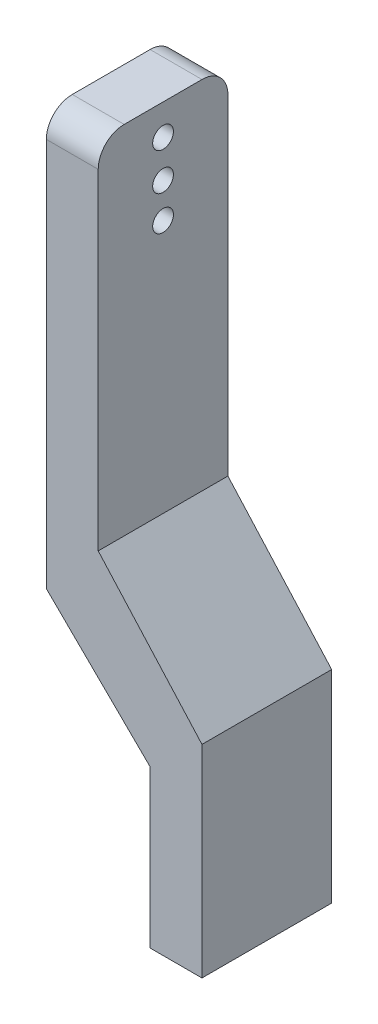
ISO-10303-21;
HEADER;
FILE_DESCRIPTION(('STEP AP214'),'2;1');
FILE_NAME('part.step','',(''),(''),'','','');
FILE_SCHEMA(('AUTOMOTIVE_DESIGN { 1 0 10303 214 1 1 1 1 }'));
ENDSEC;
DATA;
#1=APPLICATION_CONTEXT('core data for automotive mechanical design processes');
#2=APPLICATION_PROTOCOL_DEFINITION('international standard','automotive_design',2000,#1);
#3=PRODUCT_CONTEXT('',#1,'mechanical');
#4=PRODUCT('Part','Part','',(#3));
#5=PRODUCT_RELATED_PRODUCT_CATEGORY('part','',(#4));
#6=PRODUCT_DEFINITION_FORMATION('','',#4);
#7=PRODUCT_DEFINITION_CONTEXT('part definition',#1,'design');
#8=PRODUCT_DEFINITION('design','',#6,#7);
#9=PRODUCT_DEFINITION_SHAPE('','',#8);
#10=(LENGTH_UNIT() NAMED_UNIT(*) SI_UNIT(.MILLI.,.METRE.));
#11=(NAMED_UNIT(*) PLANE_ANGLE_UNIT() SI_UNIT($,.RADIAN.));
#12=(NAMED_UNIT(*) SI_UNIT($,.STERADIAN.) SOLID_ANGLE_UNIT());
#13=UNCERTAINTY_MEASURE_WITH_UNIT(LENGTH_MEASURE(1.E-05),#10,'distance_accuracy_value','');
#14=(GEOMETRIC_REPRESENTATION_CONTEXT(3) GLOBAL_UNCERTAINTY_ASSIGNED_CONTEXT((#13)) GLOBAL_UNIT_ASSIGNED_CONTEXT((#10,
#11,#12)) REPRESENTATION_CONTEXT('',''));
#15=CARTESIAN_POINT('',(0.,0.,0.));
#16=DIRECTION('',(0.,0.,1.));
#17=DIRECTION('',(1.,0.,0.));
#18=AXIS2_PLACEMENT_3D('',#15,#16,#17);
#19=CARTESIAN_POINT('',(30.,0.,25.));
#20=DIRECTION('',(1.,0.,0.));
#21=DIRECTION('',(0.,1.,0.));
#22=AXIS2_PLACEMENT_3D('',#19,#20,#21);
#23=PLANE('',#22);
#24=DIRECTION('',(0.,-1.,0.));
#25=VECTOR('',#24,1.);
#26=CARTESIAN_POINT('',(30.,0.,0.));
#27=LINE('',#26,#25);
#28=CARTESIAN_POINT('',(30.,-11.0027993061037,0.));
#29=VERTEX_POINT('',#28);
#30=CARTESIAN_POINT('',(30.,-50.,0.));
#31=VERTEX_POINT('',#30);
#32=EDGE_CURVE('E124',#29,#31,#27,.T.);
#33=ORIENTED_EDGE('',*,*,#32,.F.);
#34=DIRECTION('',(0.,0.,-1.));
#35=VECTOR('',#34,1.);
#36=CARTESIAN_POINT('',(30.,-11.0027993061037,25.));
#37=LINE('',#36,#35);
#38=CARTESIAN_POINT('',(30.,-11.0027993061037,25.));
#39=VERTEX_POINT('',#38);
#40=EDGE_CURVE('E119',#39,#29,#37,.T.);
#41=ORIENTED_EDGE('',*,*,#40,.F.);
#42=DIRECTION('',(0.,-1.,0.));
#43=VECTOR('',#42,1.);
#44=CARTESIAN_POINT('',(30.,0.,25.));
#45=LINE('',#44,#43);
#46=CARTESIAN_POINT('',(30.,-50.,25.));
#47=VERTEX_POINT('',#46);
#48=EDGE_CURVE('E121',#39,#47,#45,.T.);
#49=ORIENTED_EDGE('',*,*,#48,.T.);
#50=DIRECTION('',(0.,0.,-1.));
#51=VECTOR('',#50,1.);
#52=CARTESIAN_POINT('',(30.,-50.,25.));
#53=LINE('',#52,#51);
#54=EDGE_CURVE('E168',#47,#31,#53,.T.);
#55=ORIENTED_EDGE('',*,*,#54,.T.);
#56=EDGE_LOOP('',(#33,#41,#49,#55));
#57=FACE_BOUND('',#56,.T.);
#58=ADVANCED_FACE('F41',(#57),#23,.T.);
#59=CARTESIAN_POINT('',(11.1575041199395,10.006682870404,25.));
#60=DIRECTION('',(0.744456564774586,0.667670894351419,0.));
#61=DIRECTION('',(-0.667670894351419,0.744456564774586,0.));
#62=AXIS2_PLACEMENT_3D('',#59,#60,#61);
#63=PLANE('',#62);
#64=DIRECTION('',(0.667670894351419,-0.744456564774586,0.));
#65=VECTOR('',#64,1.);
#66=CARTESIAN_POINT('',(11.1575041199395,10.006682870404,0.));
#67=LINE('',#66,#65);
#68=CARTESIAN_POINT('',(10.,11.297306062358,0.));
#69=VERTEX_POINT('',#68);
#70=EDGE_CURVE('E171',#69,#29,#67,.T.);
#71=ORIENTED_EDGE('',*,*,#70,.F.);
#72=DIRECTION('',(0.,0.,-1.));
#73=VECTOR('',#72,1.);
#74=CARTESIAN_POINT('',(10.,11.297306062358,25.));
#75=LINE('',#74,#73);
#76=CARTESIAN_POINT('',(10.,11.297306062358,25.));
#77=VERTEX_POINT('',#76);
#78=EDGE_CURVE('E131',#77,#69,#75,.T.);
#79=ORIENTED_EDGE('',*,*,#78,.F.);
#80=DIRECTION('',(0.667670894351419,-0.744456564774586,0.));
#81=VECTOR('',#80,1.);
#82=CARTESIAN_POINT('',(11.1575041199395,10.006682870404,25.));
#83=LINE('',#82,#81);
#84=EDGE_CURVE('E137',#77,#39,#83,.T.);
#85=ORIENTED_EDGE('',*,*,#84,.T.);
#86=ORIENTED_EDGE('',*,*,#40,.T.);
#87=EDGE_LOOP('',(#71,#79,#85,#86));
#88=FACE_BOUND('',#87,.T.);
#89=ADVANCED_FACE('F145',(#88),#63,.T.);
#90=CARTESIAN_POINT('',(10.,0.,25.));
#91=DIRECTION('',(1.,0.,0.));
#92=DIRECTION('',(0.,1.,0.));
#93=AXIS2_PLACEMENT_3D('',#90,#91,#92);
#94=PLANE('',#93);
#95=CARTESIAN_POINT('',(10.,74.088859677376,12.5));
#96=DIRECTION('',(1.,0.,0.));
#97=DIRECTION('',(0.,1.,0.));
#98=AXIS2_PLACEMENT_3D('',#95,#96,#97);
#99=CIRCLE('',#98,2.);
#100=CARTESIAN_POINT('',(10.,76.088859677376,12.5));
#101=VERTEX_POINT('',#100);
#102=EDGE_CURVE('E172',#101,#101,#99,.T.);
#103=ORIENTED_EDGE('',*,*,#102,.F.);
#104=EDGE_LOOP('',(#103));
#105=FACE_BOUND('',#104,.T.);
#106=CARTESIAN_POINT('',(10.,66.9038959237328,12.5));
#107=DIRECTION('',(1.,0.,0.));
#108=DIRECTION('',(0.,1.,0.));
#109=AXIS2_PLACEMENT_3D('',#106,#107,#108);
#110=CIRCLE('',#109,2.);
#111=CARTESIAN_POINT('',(10.,68.9038959237328,12.5));
#112=VERTEX_POINT('',#111);
#113=EDGE_CURVE('E308',#112,#112,#110,.T.);
#114=ORIENTED_EDGE('',*,*,#113,.F.);
#115=EDGE_LOOP('',(#114));
#116=FACE_BOUND('',#115,.T.);
#117=CARTESIAN_POINT('',(10.,60.207705214555,12.5));
#118=DIRECTION('',(1.,0.,0.));
#119=DIRECTION('',(0.,1.,0.));
#120=AXIS2_PLACEMENT_3D('',#117,#118,#119);
#121=CIRCLE('',#120,2.);
#122=CARTESIAN_POINT('',(10.,62.207705214555,12.5));
#123=VERTEX_POINT('',#122);
#124=EDGE_CURVE('E302',#123,#123,#121,.T.);
#125=ORIENTED_EDGE('',*,*,#124,.F.);
#126=EDGE_LOOP('',(#125));
#127=FACE_BOUND('',#126,.T.);
#128=DIRECTION('',(0.,-1.,0.));
#129=VECTOR('',#128,1.);
#130=CARTESIAN_POINT('',(10.,0.,0.));
#131=LINE('',#130,#129);
#132=CARTESIAN_POINT('',(10.,75.,0.));
#133=VERTEX_POINT('',#132);
#134=EDGE_CURVE('E175',#133,#69,#131,.T.);
#135=ORIENTED_EDGE('',*,*,#134,.F.);
#136=CARTESIAN_POINT('',(10.,75.,5.));
#137=DIRECTION('',(1.,0.,0.));
#138=DIRECTION('',(0.,1.,0.));
#139=AXIS2_PLACEMENT_3D('',#136,#137,#138);
#140=CIRCLE('',#139,5.);
#141=CARTESIAN_POINT('',(10.,80.,5.));
#142=VERTEX_POINT('',#141);
#143=EDGE_CURVE('E64',#133,#142,#140,.T.);
#144=ORIENTED_EDGE('',*,*,#143,.T.);
#145=DIRECTION('',(0.,0.,-1.));
#146=VECTOR('',#145,1.);
#147=CARTESIAN_POINT('',(10.,80.,25.));
#148=LINE('',#147,#146);
#149=CARTESIAN_POINT('',(10.,80.,20.));
#150=VERTEX_POINT('',#149);
#151=EDGE_CURVE('E207',#150,#142,#148,.T.);
#152=ORIENTED_EDGE('',*,*,#151,.F.);
#153=CARTESIAN_POINT('',(10.,75.,20.));
#154=DIRECTION('',(1.,0.,0.));
#155=DIRECTION('',(0.,1.,0.));
#156=AXIS2_PLACEMENT_3D('',#153,#154,#155);
#157=CIRCLE('',#156,5.);
#158=CARTESIAN_POINT('',(10.,75.,25.));
#159=VERTEX_POINT('',#158);
#160=EDGE_CURVE('E215',#150,#159,#157,.T.);
#161=ORIENTED_EDGE('',*,*,#160,.T.);
#162=DIRECTION('',(0.,-1.,0.));
#163=VECTOR('',#162,1.);
#164=CARTESIAN_POINT('',(10.,0.,25.));
#165=LINE('',#164,#163);
#166=EDGE_CURVE('E148',#159,#77,#165,.T.);
#167=ORIENTED_EDGE('',*,*,#166,.T.);
#168=ORIENTED_EDGE('',*,*,#78,.T.);
#169=EDGE_LOOP('',(#135,#144,#152,#161,#167,#168));
#170=FACE_BOUND('',#169,.T.);
#171=ADVANCED_FACE('F236',(#105,#116,#127,#170),#94,.T.);
#172=CARTESIAN_POINT('',(0.,80.,25.));
#173=DIRECTION('',(0.,1.,0.));
#174=DIRECTION('',(0.,0.,1.));
#175=AXIS2_PLACEMENT_3D('',#172,#173,#174);
#176=PLANE('',#175);
#177=ORIENTED_EDGE('',*,*,#151,.T.);
#178=DIRECTION('',(1.,0.,0.));
#179=VECTOR('',#178,1.);
#180=CARTESIAN_POINT('',(0.,80.,5.));
#181=LINE('',#180,#179);
#182=CARTESIAN_POINT('',(0.,80.,5.));
#183=VERTEX_POINT('',#182);
#184=EDGE_CURVE('E50',#142,#183,#181,.F.);
#185=ORIENTED_EDGE('',*,*,#184,.T.);
#186=DIRECTION('',(0.,0.,-1.));
#187=VECTOR('',#186,1.);
#188=CARTESIAN_POINT('',(0.,80.,25.));
#189=LINE('',#188,#187);
#190=CARTESIAN_POINT('',(0.,80.,20.));
#191=VERTEX_POINT('',#190);
#192=EDGE_CURVE('E204',#191,#183,#189,.T.);
#193=ORIENTED_EDGE('',*,*,#192,.F.);
#194=DIRECTION('',(1.,0.,0.));
#195=VECTOR('',#194,1.);
#196=CARTESIAN_POINT('',(0.,80.,20.));
#197=LINE('',#196,#195);
#198=EDGE_CURVE('E130',#191,#150,#197,.T.);
#199=ORIENTED_EDGE('',*,*,#198,.T.);
#200=EDGE_LOOP('',(#177,#185,#193,#199));
#201=FACE_BOUND('',#200,.T.);
#202=ADVANCED_FACE('F266',(#201),#176,.T.);
#203=CARTESIAN_POINT('',(0.,0.,25.));
#204=DIRECTION('',(-1.,0.,0.));
#205=DIRECTION('',(0.,0.,1.));
#206=AXIS2_PLACEMENT_3D('',#203,#204,#205);
#207=PLANE('',#206);
#208=CARTESIAN_POINT('',(0.,74.088859677376,12.5));
#209=DIRECTION('',(-1.,0.,0.));
#210=DIRECTION('',(0.,0.,1.));
#211=AXIS2_PLACEMENT_3D('',#208,#209,#210);
#212=CIRCLE('',#211,2.);
#213=CARTESIAN_POINT('',(0.,74.088859677376,14.5));
#214=VERTEX_POINT('',#213);
#215=EDGE_CURVE('E300',#214,#214,#212,.T.);
#216=ORIENTED_EDGE('',*,*,#215,.F.);
#217=EDGE_LOOP('',(#216));
#218=FACE_BOUND('',#217,.T.);
#219=CARTESIAN_POINT('',(0.,66.9038959237328,12.5));
#220=DIRECTION('',(-1.,0.,0.));
#221=DIRECTION('',(0.,0.,1.));
#222=AXIS2_PLACEMENT_3D('',#219,#220,#221);
#223=CIRCLE('',#222,2.);
#224=CARTESIAN_POINT('',(0.,66.9038959237328,14.5));
#225=VERTEX_POINT('',#224);
#226=EDGE_CURVE('E303',#225,#225,#223,.T.);
#227=ORIENTED_EDGE('',*,*,#226,.F.);
#228=EDGE_LOOP('',(#227));
#229=FACE_BOUND('',#228,.T.);
#230=CARTESIAN_POINT('',(0.,60.207705214555,12.5));
#231=DIRECTION('',(-1.,0.,0.));
#232=DIRECTION('',(0.,0.,1.));
#233=AXIS2_PLACEMENT_3D('',#230,#231,#232);
#234=CIRCLE('',#233,2.);
#235=CARTESIAN_POINT('',(0.,60.207705214555,14.5));
#236=VERTEX_POINT('',#235);
#237=EDGE_CURVE('E311',#236,#236,#234,.T.);
#238=ORIENTED_EDGE('',*,*,#237,.F.);
#239=EDGE_LOOP('',(#238));
#240=FACE_BOUND('',#239,.T.);
#241=ORIENTED_EDGE('',*,*,#192,.T.);
#242=CARTESIAN_POINT('',(0.,75.,5.));
#243=DIRECTION('',(-1.,0.,0.));
#244=DIRECTION('',(0.,0.,1.));
#245=AXIS2_PLACEMENT_3D('',#242,#243,#244);
#246=CIRCLE('',#245,5.);
#247=CARTESIAN_POINT('',(0.,75.,0.));
#248=VERTEX_POINT('',#247);
#249=EDGE_CURVE('E11',#183,#248,#246,.T.);
#250=ORIENTED_EDGE('',*,*,#249,.T.);
#251=DIRECTION('',(0.,1.,0.));
#252=VECTOR('',#251,1.);
#253=CARTESIAN_POINT('',(0.,0.,0.));
#254=LINE('',#253,#252);
#255=CARTESIAN_POINT('',(0.,0.,0.));
#256=VERTEX_POINT('',#255);
#257=EDGE_CURVE('E178',#256,#248,#254,.T.);
#258=ORIENTED_EDGE('',*,*,#257,.F.);
#259=DIRECTION('',(0.,0.,-1.));
#260=VECTOR('',#259,1.);
#261=CARTESIAN_POINT('',(0.,0.,25.));
#262=LINE('',#261,#260);
#263=CARTESIAN_POINT('',(0.,0.,25.));
#264=VERTEX_POINT('',#263);
#265=EDGE_CURVE('E201',#264,#256,#262,.T.);
#266=ORIENTED_EDGE('',*,*,#265,.F.);
#267=DIRECTION('',(0.,1.,0.));
#268=VECTOR('',#267,1.);
#269=CARTESIAN_POINT('',(0.,0.,25.));
#270=LINE('',#269,#268);
#271=CARTESIAN_POINT('',(0.,75.,25.));
#272=VERTEX_POINT('',#271);
#273=EDGE_CURVE('E151',#264,#272,#270,.T.);
#274=ORIENTED_EDGE('',*,*,#273,.T.);
#275=CARTESIAN_POINT('',(0.,75.,20.));
#276=DIRECTION('',(-1.,0.,0.));
#277=DIRECTION('',(0.,0.,1.));
#278=AXIS2_PLACEMENT_3D('',#275,#276,#277);
#279=CIRCLE('',#278,5.);
#280=EDGE_CURVE('E221',#272,#191,#279,.T.);
#281=ORIENTED_EDGE('',*,*,#280,.T.);
#282=EDGE_LOOP('',(#241,#250,#258,#266,#274,#281));
#283=FACE_BOUND('',#282,.T.);
#284=ADVANCED_FACE('F249',(#218,#229,#240,#283),#207,.T.);
#285=CARTESIAN_POINT('',(0.,0.,25.));
#286=DIRECTION('',(-0.702396335883424,-0.711786054469698,0.));
#287=DIRECTION('',(0.711786054469698,-0.702396335883424,0.));
#288=AXIS2_PLACEMENT_3D('',#285,#286,#287);
#289=PLANE('',#288);
#290=DIRECTION('',(-0.711786054469698,0.702396335883424,0.));
#291=VECTOR('',#290,1.);
#292=CARTESIAN_POINT('',(0.,0.,0.));
#293=LINE('',#292,#291);
#294=CARTESIAN_POINT('',(20.,-19.7361645812724,0.));
#295=VERTEX_POINT('',#294);
#296=EDGE_CURVE('E182',#295,#256,#293,.T.);
#297=ORIENTED_EDGE('',*,*,#296,.F.);
#298=DIRECTION('',(0.,0.,-1.));
#299=VECTOR('',#298,1.);
#300=CARTESIAN_POINT('',(20.,-19.7361645812724,25.));
#301=LINE('',#300,#299);
#302=CARTESIAN_POINT('',(20.,-19.7361645812724,25.));
#303=VERTEX_POINT('',#302);
#304=EDGE_CURVE('E198',#303,#295,#301,.T.);
#305=ORIENTED_EDGE('',*,*,#304,.F.);
#306=DIRECTION('',(-0.711786054469698,0.702396335883424,0.));
#307=VECTOR('',#306,1.);
#308=CARTESIAN_POINT('',(0.,0.,25.));
#309=LINE('',#308,#307);
#310=EDGE_CURVE('E158',#303,#264,#309,.T.);
#311=ORIENTED_EDGE('',*,*,#310,.T.);
#312=ORIENTED_EDGE('',*,*,#265,.T.);
#313=EDGE_LOOP('',(#297,#305,#311,#312));
#314=FACE_BOUND('',#313,.T.);
#315=ADVANCED_FACE('F245',(#314),#289,.T.);
#316=CARTESIAN_POINT('',(20.,0.,25.));
#317=DIRECTION('',(-1.,0.,0.));
#318=DIRECTION('',(0.,0.,1.));
#319=AXIS2_PLACEMENT_3D('',#316,#317,#318);
#320=PLANE('',#319);
#321=DIRECTION('',(0.,1.,0.));
#322=VECTOR('',#321,1.);
#323=CARTESIAN_POINT('',(20.,0.,0.));
#324=LINE('',#323,#322);
#325=CARTESIAN_POINT('',(20.,-50.,0.));
#326=VERTEX_POINT('',#325);
#327=EDGE_CURVE('E186',#326,#295,#324,.T.);
#328=ORIENTED_EDGE('',*,*,#327,.F.);
#329=DIRECTION('',(0.,0.,-1.));
#330=VECTOR('',#329,1.);
#331=CARTESIAN_POINT('',(20.,-50.,25.));
#332=LINE('',#331,#330);
#333=CARTESIAN_POINT('',(20.,-50.,25.));
#334=VERTEX_POINT('',#333);
#335=EDGE_CURVE('E195',#334,#326,#332,.T.);
#336=ORIENTED_EDGE('',*,*,#335,.F.);
#337=DIRECTION('',(0.,1.,0.));
#338=VECTOR('',#337,1.);
#339=CARTESIAN_POINT('',(20.,0.,25.));
#340=LINE('',#339,#338);
#341=EDGE_CURVE('E162',#334,#303,#340,.T.);
#342=ORIENTED_EDGE('',*,*,#341,.T.);
#343=ORIENTED_EDGE('',*,*,#304,.T.);
#344=EDGE_LOOP('',(#328,#336,#342,#343));
#345=FACE_BOUND('',#344,.T.);
#346=ADVANCED_FACE('F242',(#345),#320,.T.);
#347=CARTESIAN_POINT('',(0.,-50.,25.));
#348=DIRECTION('',(0.,-1.,0.));
#349=DIRECTION('',(0.,0.,-1.));
#350=AXIS2_PLACEMENT_3D('',#347,#348,#349);
#351=PLANE('',#350);
#352=DIRECTION('',(-1.,0.,0.));
#353=VECTOR('',#352,1.);
#354=CARTESIAN_POINT('',(0.,-50.,0.));
#355=LINE('',#354,#353);
#356=EDGE_CURVE('E142',#31,#326,#355,.T.);
#357=ORIENTED_EDGE('',*,*,#356,.F.);
#358=ORIENTED_EDGE('',*,*,#54,.F.);
#359=DIRECTION('',(-1.,0.,0.));
#360=VECTOR('',#359,1.);
#361=CARTESIAN_POINT('',(0.,-50.,25.));
#362=LINE('',#361,#360);
#363=EDGE_CURVE('E140',#47,#334,#362,.T.);
#364=ORIENTED_EDGE('',*,*,#363,.T.);
#365=ORIENTED_EDGE('',*,*,#335,.T.);
#366=EDGE_LOOP('',(#357,#358,#364,#365));
#367=FACE_BOUND('',#366,.T.);
#368=ADVANCED_FACE('F239',(#367),#351,.T.);
#369=CARTESIAN_POINT('',(0.,0.,25.));
#370=DIRECTION('',(0.,0.,1.));
#371=DIRECTION('',(1.,0.,0.));
#372=AXIS2_PLACEMENT_3D('',#369,#370,#371);
#373=PLANE('',#372);
#374=ORIENTED_EDGE('',*,*,#166,.F.);
#375=DIRECTION('',(1.,0.,0.));
#376=VECTOR('',#375,1.);
#377=CARTESIAN_POINT('',(0.,75.,25.));
#378=LINE('',#377,#376);
#379=EDGE_CURVE('E218',#159,#272,#378,.F.);
#380=ORIENTED_EDGE('',*,*,#379,.T.);
#381=ORIENTED_EDGE('',*,*,#273,.F.);
#382=ORIENTED_EDGE('',*,*,#310,.F.);
#383=ORIENTED_EDGE('',*,*,#341,.F.);
#384=ORIENTED_EDGE('',*,*,#363,.F.);
#385=ORIENTED_EDGE('',*,*,#48,.F.);
#386=ORIENTED_EDGE('',*,*,#84,.F.);
#387=EDGE_LOOP('',(#374,#380,#381,#382,#383,#384,#385,#386));
#388=FACE_BOUND('',#387,.T.);
#389=ADVANCED_FACE('F136',(#388),#373,.T.);
#390=CARTESIAN_POINT('',(0.,0.,0.));
#391=DIRECTION('',(0.,0.,1.));
#392=DIRECTION('',(1.,0.,0.));
#393=AXIS2_PLACEMENT_3D('',#390,#391,#392);
#394=PLANE('',#393);
#395=ORIENTED_EDGE('',*,*,#257,.T.);
#396=DIRECTION('',(1.,0.,0.));
#397=VECTOR('',#396,1.);
#398=CARTESIAN_POINT('',(10.,75.,0.));
#399=LINE('',#398,#397);
#400=EDGE_CURVE('E224',#248,#133,#399,.T.);
#401=ORIENTED_EDGE('',*,*,#400,.T.);
#402=ORIENTED_EDGE('',*,*,#134,.T.);
#403=ORIENTED_EDGE('',*,*,#70,.T.);
#404=ORIENTED_EDGE('',*,*,#32,.T.);
#405=ORIENTED_EDGE('',*,*,#356,.T.);
#406=ORIENTED_EDGE('',*,*,#327,.T.);
#407=ORIENTED_EDGE('',*,*,#296,.T.);
#408=EDGE_LOOP('',(#395,#401,#402,#403,#404,#405,#406,#407));
#409=FACE_BOUND('',#408,.T.);
#410=ADVANCED_FACE('F232',(#409),#394,.F.);
#411=CARTESIAN_POINT('',(25.,60.207705214555,12.5));
#412=DIRECTION('',(-1.,0.,0.));
#413=DIRECTION('',(0.,0.,1.));
#414=AXIS2_PLACEMENT_3D('',#411,#412,#413);
#415=CYLINDRICAL_SURFACE('',#414,2.);
#416=ORIENTED_EDGE('',*,*,#124,.T.);
#417=EDGE_LOOP('',(#416));
#418=FACE_BOUND('',#417,.T.);
#419=ORIENTED_EDGE('',*,*,#237,.T.);
#420=EDGE_LOOP('',(#419));
#421=FACE_BOUND('',#420,.T.);
#422=ADVANCED_FACE('F281',(#418,#421),#415,.F.);
#423=CARTESIAN_POINT('',(25.,66.9038959237328,12.5));
#424=DIRECTION('',(-1.,0.,0.));
#425=DIRECTION('',(0.,0.,1.));
#426=AXIS2_PLACEMENT_3D('',#423,#424,#425);
#427=CYLINDRICAL_SURFACE('',#426,2.);
#428=ORIENTED_EDGE('',*,*,#113,.T.);
#429=EDGE_LOOP('',(#428));
#430=FACE_BOUND('',#429,.T.);
#431=ORIENTED_EDGE('',*,*,#226,.T.);
#432=EDGE_LOOP('',(#431));
#433=FACE_BOUND('',#432,.T.);
#434=ADVANCED_FACE('F286',(#430,#433),#427,.F.);
#435=CARTESIAN_POINT('',(25.,74.088859677376,12.5));
#436=DIRECTION('',(-1.,0.,0.));
#437=DIRECTION('',(0.,0.,1.));
#438=AXIS2_PLACEMENT_3D('',#435,#436,#437);
#439=CYLINDRICAL_SURFACE('',#438,2.);
#440=ORIENTED_EDGE('',*,*,#102,.T.);
#441=EDGE_LOOP('',(#440));
#442=FACE_BOUND('',#441,.T.);
#443=ORIENTED_EDGE('',*,*,#215,.T.);
#444=EDGE_LOOP('',(#443));
#445=FACE_BOUND('',#444,.T.);
#446=ADVANCED_FACE('F255',(#442,#445),#439,.F.);
#447=CARTESIAN_POINT('',(0.,75.,20.));
#448=DIRECTION('',(1.,0.,0.));
#449=DIRECTION('',(0.,0.,-1.));
#450=AXIS2_PLACEMENT_3D('',#447,#448,#449);
#451=CYLINDRICAL_SURFACE('',#450,5.);
#452=ORIENTED_EDGE('',*,*,#280,.F.);
#453=ORIENTED_EDGE('',*,*,#379,.F.);
#454=ORIENTED_EDGE('',*,*,#160,.F.);
#455=ORIENTED_EDGE('',*,*,#198,.F.);
#456=EDGE_LOOP('',(#452,#453,#454,#455));
#457=FACE_BOUND('',#456,.T.);
#458=ADVANCED_FACE('F251',(#457),#451,.T.);
#459=CARTESIAN_POINT('',(0.,75.,5.));
#460=DIRECTION('',(-1.,0.,0.));
#461=DIRECTION('',(0.,0.,1.));
#462=AXIS2_PLACEMENT_3D('',#459,#460,#461);
#463=CYLINDRICAL_SURFACE('',#462,5.);
#464=ORIENTED_EDGE('',*,*,#249,.F.);
#465=ORIENTED_EDGE('',*,*,#184,.F.);
#466=ORIENTED_EDGE('',*,*,#143,.F.);
#467=ORIENTED_EDGE('',*,*,#400,.F.);
#468=EDGE_LOOP('',(#464,#465,#466,#467));
#469=FACE_BOUND('',#468,.T.);
#470=ADVANCED_FACE('F43',(#469),#463,.T.);
#471=CLOSED_SHELL('',(#58,#89,#171,#202,#284,#315,#346,#368,#389,#410,#422,#434,#446,#458,#470));
#472=MANIFOLD_SOLID_BREP('B2',#471);
#473=ADVANCED_BREP_SHAPE_REPRESENTATION('',(#18,#472),#14);
#474=SHAPE_DEFINITION_REPRESENTATION(#9,#473);
ENDSEC;
END-ISO-10303-21;
